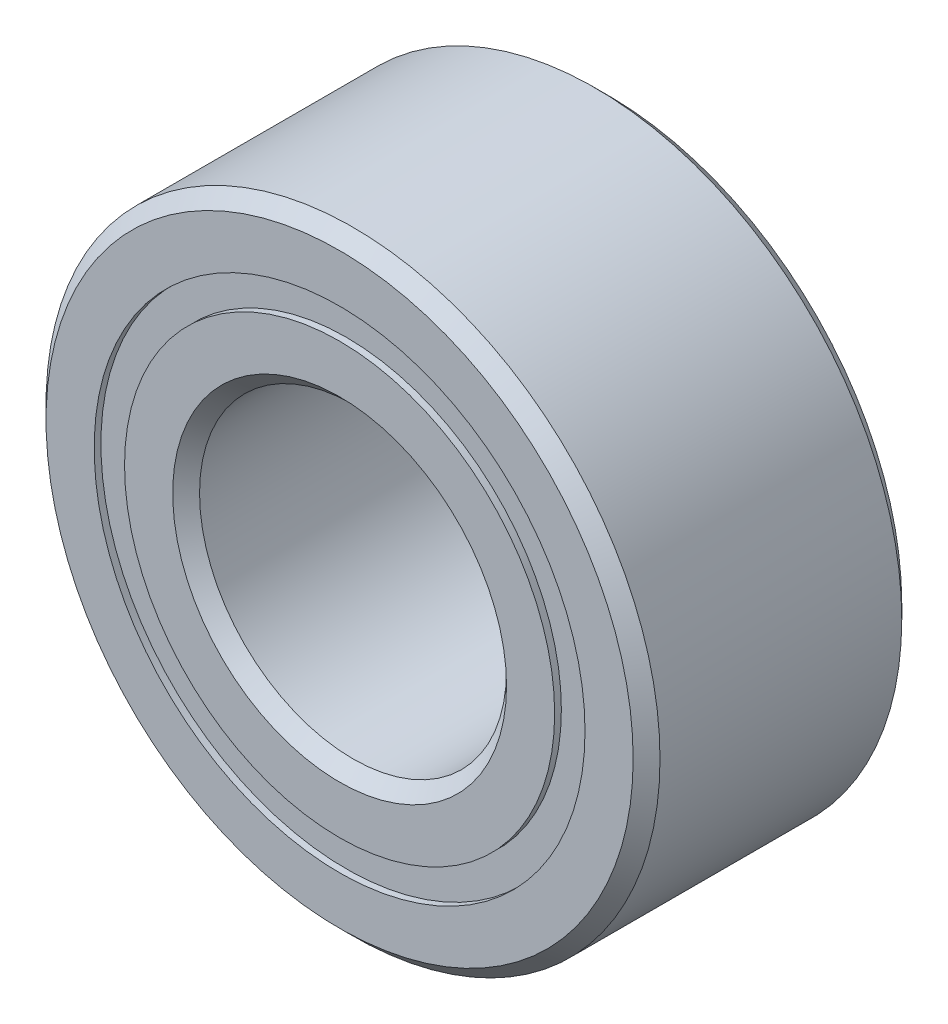
ISO-10303-21;
HEADER;
FILE_DESCRIPTION(('STEP AP214'),'2;1');
FILE_NAME('part.step','',(''),(''),'','','');
FILE_SCHEMA(('AUTOMOTIVE_DESIGN { 1 0 10303 214 1 1 1 1 }'));
ENDSEC;
DATA;
#1=APPLICATION_CONTEXT('core data for automotive mechanical design processes');
#2=APPLICATION_PROTOCOL_DEFINITION('international standard','automotive_design',2000,#1);
#3=PRODUCT_CONTEXT('',#1,'mechanical');
#4=PRODUCT('Part','Part','',(#3));
#5=PRODUCT_RELATED_PRODUCT_CATEGORY('part','',(#4));
#6=PRODUCT_DEFINITION_FORMATION('','',#4);
#7=PRODUCT_DEFINITION_CONTEXT('part definition',#1,'design');
#8=PRODUCT_DEFINITION('design','',#6,#7);
#9=PRODUCT_DEFINITION_SHAPE('','',#8);
#10=(LENGTH_UNIT() NAMED_UNIT(*) SI_UNIT(.MILLI.,.METRE.));
#11=(NAMED_UNIT(*) PLANE_ANGLE_UNIT() SI_UNIT($,.RADIAN.));
#12=(NAMED_UNIT(*) SI_UNIT($,.STERADIAN.) SOLID_ANGLE_UNIT());
#13=UNCERTAINTY_MEASURE_WITH_UNIT(LENGTH_MEASURE(1.E-05),#10,'distance_accuracy_value','');
#14=(GEOMETRIC_REPRESENTATION_CONTEXT(3) GLOBAL_UNCERTAINTY_ASSIGNED_CONTEXT((#13)) GLOBAL_UNIT_ASSIGNED_CONTEXT((#10,
#11,#12)) REPRESENTATION_CONTEXT('',''));
#15=CARTESIAN_POINT('',(0.,0.,0.));
#16=DIRECTION('',(0.,0.,1.));
#17=DIRECTION('',(1.,0.,0.));
#18=AXIS2_PLACEMENT_3D('',#15,#16,#17);
#19=CARTESIAN_POINT('',(0.,2.53825549450549,-1.319609375));
#20=DIRECTION('',(0.,0.,1.));
#21=DIRECTION('',(1.,0.,0.));
#22=AXIS2_PLACEMENT_3D('',#19,#20,#21);
#23=PLANE('',#22);
#24=CARTESIAN_POINT('',(0.,0.,-1.319609375));
#25=DIRECTION('',(0.,0.,1.));
#26=DIRECTION('',(1.,0.,0.));
#27=AXIS2_PLACEMENT_3D('',#24,#25,#26);
#28=CIRCLE('',#27,2.53825549450549);
#29=CARTESIAN_POINT('',(2.53825549450549,0.,-1.319609375));
#30=VERTEX_POINT('',#29);
#31=EDGE_CURVE('E59',#30,#30,#28,.T.);
#32=ORIENTED_EDGE('',*,*,#31,.F.);
#33=EDGE_LOOP('',(#32));
#34=FACE_BOUND('',#33,.T.);
#35=CARTESIAN_POINT('',(0.,0.,-1.319609375));
#36=DIRECTION('',(0.,0.,1.));
#37=DIRECTION('',(1.,0.,0.));
#38=AXIS2_PLACEMENT_3D('',#35,#36,#37);
#39=CIRCLE('',#38,2.22424450549451);
#40=CARTESIAN_POINT('',(2.22424450549451,0.,-1.319609375));
#41=VERTEX_POINT('',#40);
#42=EDGE_CURVE('E11',#41,#41,#39,.T.);
#43=ORIENTED_EDGE('',*,*,#42,.T.);
#44=EDGE_LOOP('',(#43));
#45=FACE_BOUND('',#44,.T.);
#46=ADVANCED_FACE('F45',(#34,#45),#23,.F.);
#47=CARTESIAN_POINT('',(0.,0.,1.3890625));
#48=DIRECTION('',(0.,0.,1.));
#49=DIRECTION('',(1.,0.,0.));
#50=AXIS2_PLACEMENT_3D('',#47,#48,#49);
#51=CYLINDRICAL_SURFACE('',#50,2.22424450549451);
#52=ORIENTED_EDGE('',*,*,#42,.F.);
#53=EDGE_LOOP('',(#52));
#54=FACE_BOUND('',#53,.T.);
#55=CARTESIAN_POINT('',(0.,0.,-0.637012925157144));
#56=DIRECTION('',(0.,0.,1.));
#57=DIRECTION('',(1.,0.,0.));
#58=AXIS2_PLACEMENT_3D('',#55,#56,#57);
#59=CIRCLE('',#58,2.22424450549451);
#60=CARTESIAN_POINT('',(2.22424450549451,0.,-0.637012925157144));
#61=VERTEX_POINT('',#60);
#62=EDGE_CURVE('E51',#61,#61,#59,.T.);
#63=ORIENTED_EDGE('',*,*,#62,.T.);
#64=EDGE_LOOP('',(#63));
#65=FACE_BOUND('',#64,.T.);
#66=ADVANCED_FACE('F68',(#54,#65),#51,.F.);
#67=CARTESIAN_POINT('',(0.,2.53825549450549,-0.637012925157144));
#68=DIRECTION('',(0.,0.,-1.));
#69=DIRECTION('',(-1.,0.,0.));
#70=AXIS2_PLACEMENT_3D('',#67,#68,#69);
#71=PLANE('',#70);
#72=ORIENTED_EDGE('',*,*,#62,.F.);
#73=EDGE_LOOP('',(#72));
#74=FACE_BOUND('',#73,.T.);
#75=CARTESIAN_POINT('',(0.,0.,-0.637012925157144));
#76=DIRECTION('',(0.,0.,1.));
#77=DIRECTION('',(1.,0.,0.));
#78=AXIS2_PLACEMENT_3D('',#75,#76,#77);
#79=CIRCLE('',#78,2.53825549450549);
#80=CARTESIAN_POINT('',(2.53825549450549,0.,-0.637012925157144));
#81=VERTEX_POINT('',#80);
#82=EDGE_CURVE('E55',#81,#81,#79,.T.);
#83=ORIENTED_EDGE('',*,*,#82,.T.);
#84=EDGE_LOOP('',(#83));
#85=FACE_BOUND('',#84,.T.);
#86=ADVANCED_FACE('F72',(#74,#85),#71,.F.);
#87=CARTESIAN_POINT('',(0.,0.,1.3890625));
#88=DIRECTION('',(0.,0.,1.));
#89=DIRECTION('',(1.,0.,0.));
#90=AXIS2_PLACEMENT_3D('',#87,#88,#89);
#91=CYLINDRICAL_SURFACE('',#90,2.53825549450549);
#92=ORIENTED_EDGE('',*,*,#82,.F.);
#93=EDGE_LOOP('',(#92));
#94=FACE_BOUND('',#93,.T.);
#95=ORIENTED_EDGE('',*,*,#31,.T.);
#96=EDGE_LOOP('',(#95));
#97=FACE_BOUND('',#96,.T.);
#98=ADVANCED_FACE('F65',(#94,#97),#91,.T.);
#99=CLOSED_SHELL('',(#46,#66,#86,#98));
#100=MANIFOLD_SOLID_BREP('B2',#99);
#101=CARTESIAN_POINT('',(0.,2.53825549450549,1.319609375));
#102=DIRECTION('',(0.,0.,-1.));
#103=DIRECTION('',(-1.,0.,0.));
#104=AXIS2_PLACEMENT_3D('',#101,#102,#103);
#105=PLANE('',#104);
#106=CARTESIAN_POINT('',(0.,0.,1.319609375));
#107=DIRECTION('',(0.,0.,1.));
#108=DIRECTION('',(1.,0.,0.));
#109=AXIS2_PLACEMENT_3D('',#106,#107,#108);
#110=CIRCLE('',#109,2.2242445054945);
#111=CARTESIAN_POINT('',(2.2242445054945,0.,1.319609375));
#112=VERTEX_POINT('',#111);
#113=EDGE_CURVE('E44',#112,#112,#110,.T.);
#114=ORIENTED_EDGE('',*,*,#113,.F.);
#115=EDGE_LOOP('',(#114));
#116=FACE_BOUND('',#115,.T.);
#117=CARTESIAN_POINT('',(0.,0.,1.319609375));
#118=DIRECTION('',(0.,0.,1.));
#119=DIRECTION('',(1.,0.,0.));
#120=AXIS2_PLACEMENT_3D('',#117,#118,#119);
#121=CIRCLE('',#120,2.53825549450549);
#122=CARTESIAN_POINT('',(2.53825549450549,0.,1.319609375));
#123=VERTEX_POINT('',#122);
#124=EDGE_CURVE('E134',#123,#123,#121,.T.);
#125=ORIENTED_EDGE('',*,*,#124,.T.);
#126=EDGE_LOOP('',(#125));
#127=FACE_BOUND('',#126,.T.);
#128=ADVANCED_FACE('F120',(#116,#127),#105,.F.);
#129=CARTESIAN_POINT('',(0.,0.,1.3890625));
#130=DIRECTION('',(0.,0.,1.));
#131=DIRECTION('',(1.,0.,0.));
#132=AXIS2_PLACEMENT_3D('',#129,#130,#131);
#133=CYLINDRICAL_SURFACE('',#132,2.2242445054945);
#134=CARTESIAN_POINT('',(0.,0.,0.637012925157143));
#135=DIRECTION('',(0.,0.,1.));
#136=DIRECTION('',(1.,0.,0.));
#137=AXIS2_PLACEMENT_3D('',#134,#135,#136);
#138=CIRCLE('',#137,2.2242445054945);
#139=CARTESIAN_POINT('',(2.2242445054945,0.,0.637012925157143));
#140=VERTEX_POINT('',#139);
#141=EDGE_CURVE('E126',#140,#140,#138,.T.);
#142=ORIENTED_EDGE('',*,*,#141,.F.);
#143=EDGE_LOOP('',(#142));
#144=FACE_BOUND('',#143,.T.);
#145=ORIENTED_EDGE('',*,*,#113,.T.);
#146=EDGE_LOOP('',(#145));
#147=FACE_BOUND('',#146,.T.);
#148=ADVANCED_FACE('F149',(#144,#147),#133,.F.);
#149=CARTESIAN_POINT('',(0.,2.53825549450549,0.637012925157143));
#150=DIRECTION('',(0.,0.,1.));
#151=DIRECTION('',(1.,0.,0.));
#152=AXIS2_PLACEMENT_3D('',#149,#150,#151);
#153=PLANE('',#152);
#154=CARTESIAN_POINT('',(0.,0.,0.637012925157143));
#155=DIRECTION('',(0.,0.,1.));
#156=DIRECTION('',(1.,0.,0.));
#157=AXIS2_PLACEMENT_3D('',#154,#155,#156);
#158=CIRCLE('',#157,2.53825549450549);
#159=CARTESIAN_POINT('',(2.53825549450549,0.,0.637012925157143));
#160=VERTEX_POINT('',#159);
#161=EDGE_CURVE('E130',#160,#160,#158,.T.);
#162=ORIENTED_EDGE('',*,*,#161,.F.);
#163=EDGE_LOOP('',(#162));
#164=FACE_BOUND('',#163,.T.);
#165=ORIENTED_EDGE('',*,*,#141,.T.);
#166=EDGE_LOOP('',(#165));
#167=FACE_BOUND('',#166,.T.);
#168=ADVANCED_FACE('F144',(#164,#167),#153,.F.);
#169=CARTESIAN_POINT('',(0.,0.,1.3890625));
#170=DIRECTION('',(0.,0.,1.));
#171=DIRECTION('',(1.,0.,0.));
#172=AXIS2_PLACEMENT_3D('',#169,#170,#171);
#173=CYLINDRICAL_SURFACE('',#172,2.53825549450549);
#174=ORIENTED_EDGE('',*,*,#124,.F.);
#175=EDGE_LOOP('',(#174));
#176=FACE_BOUND('',#175,.T.);
#177=ORIENTED_EDGE('',*,*,#161,.T.);
#178=EDGE_LOOP('',(#177));
#179=FACE_BOUND('',#178,.T.);
#180=ADVANCED_FACE('F141',(#176,#179),#173,.T.);
#181=CLOSED_SHELL('',(#128,#148,#168,#180));
#182=MANIFOLD_SOLID_BREP('B6',#181);
#183=CARTESIAN_POINT('',(-1.39966363202143,1.92647171785536,0.));
#184=DIRECTION('',(0.,0.,1.));
#185=DIRECTION('',(-0.587785252292462,0.809016994374955,0.));
#186=AXIS2_PLACEMENT_3D('',#183,#184,#185);
#187=SPHERICAL_SURFACE('',#186,0.637012925157143);
#188=CARTESIAN_POINT('',(-1.39966363202143,1.92647171785536,0.637012925157143));
#189=VERTEX_POINT('',#188);
#190=VERTEX_LOOP('',#189);
#191=FACE_BOUND('',#190,.T.);
#192=ADVANCED_FACE('F195',(#191),#187,.T.);
#193=CLOSED_SHELL('',(#192));
#194=MANIFOLD_SOLID_BREP('B39',#193);
#195=CARTESIAN_POINT('',(-2.26470332942783,0.735846717855369,0.));
#196=DIRECTION('',(0.,0.,1.));
#197=DIRECTION('',(-0.95105651629515,0.309016994374958,0.));
#198=AXIS2_PLACEMENT_3D('',#195,#196,#197);
#199=SPHERICAL_SURFACE('',#198,0.637012925157143);
#200=CARTESIAN_POINT('',(-2.26470332942783,0.735846717855369,0.637012925157143));
#201=VERTEX_POINT('',#200);
#202=VERTEX_LOOP('',#201);
#203=FACE_BOUND('',#202,.T.);
#204=ADVANCED_FACE('F217',(#203),#199,.T.);
#205=CLOSED_SHELL('',(#204));
#206=MANIFOLD_SOLID_BREP('B116',#205);
#207=CARTESIAN_POINT('',(-2.26470332942784,-0.735846717855322,0.));
#208=DIRECTION('',(0.,0.,1.));
#209=DIRECTION('',(-0.951056516295157,-0.309016994374938,0.));
#210=AXIS2_PLACEMENT_3D('',#207,#208,#209);
#211=SPHERICAL_SURFACE('',#210,0.637012925157143);
#212=CARTESIAN_POINT('',(-2.26470332942784,-0.735846717855322,0.637012925157143));
#213=VERTEX_POINT('',#212);
#214=VERTEX_LOOP('',#213);
#215=FACE_BOUND('',#214,.T.);
#216=ADVANCED_FACE('F239',(#215),#211,.T.);
#217=CLOSED_SHELL('',(#216));
#218=MANIFOLD_SOLID_BREP('B191',#217);
#219=CARTESIAN_POINT('',(-1.39966363202147,-1.92647171785533,0.));
#220=DIRECTION('',(0.,0.,1.));
#221=DIRECTION('',(-0.58778525229248,-0.809016994374942,0.));
#222=AXIS2_PLACEMENT_3D('',#219,#220,#221);
#223=SPHERICAL_SURFACE('',#222,0.637012925157143);
#224=CARTESIAN_POINT('',(-1.39966363202147,-1.92647171785533,0.637012925157143));
#225=VERTEX_POINT('',#224);
#226=VERTEX_LOOP('',#225);
#227=FACE_BOUND('',#226,.T.);
#228=ADVANCED_FACE('F261',(#227),#223,.T.);
#229=CLOSED_SHELL('',(#228));
#230=MANIFOLD_SOLID_BREP('B213',#229);
#231=CARTESIAN_POINT('',(0.,-2.38125,0.));
#232=DIRECTION('',(0.,0.,1.));
#233=DIRECTION('',(0.,-1.,0.));
#234=AXIS2_PLACEMENT_3D('',#231,#232,#233);
#235=SPHERICAL_SURFACE('',#234,0.637012925157143);
#236=CARTESIAN_POINT('',(0.,-2.38125,0.637012925157143));
#237=VERTEX_POINT('',#236);
#238=VERTEX_LOOP('',#237);
#239=FACE_BOUND('',#238,.T.);
#240=ADVANCED_FACE('F283',(#239),#235,.T.);
#241=CLOSED_SHELL('',(#240));
#242=MANIFOLD_SOLID_BREP('B235',#241);
#243=CARTESIAN_POINT('',(1.39966363202144,-1.92647171785535,0.));
#244=DIRECTION('',(0.,0.,1.));
#245=DIRECTION('',(0.587785252292469,-0.809016994374951,0.));
#246=AXIS2_PLACEMENT_3D('',#243,#244,#245);
#247=SPHERICAL_SURFACE('',#246,0.637012925157143);
#248=CARTESIAN_POINT('',(1.39966363202144,-1.92647171785535,0.637012925157143));
#249=VERTEX_POINT('',#248);
#250=VERTEX_LOOP('',#249);
#251=FACE_BOUND('',#250,.T.);
#252=ADVANCED_FACE('F305',(#251),#247,.T.);
#253=CLOSED_SHELL('',(#252));
#254=MANIFOLD_SOLID_BREP('B257',#253);
#255=CARTESIAN_POINT('',(2.26470332942783,-0.735846717855353,0.));
#256=DIRECTION('',(0.,0.,1.));
#257=DIRECTION('',(0.951056516295152,-0.309016994374952,0.));
#258=AXIS2_PLACEMENT_3D('',#255,#256,#257);
#259=SPHERICAL_SURFACE('',#258,0.637012925157143);
#260=CARTESIAN_POINT('',(2.26470332942783,-0.735846717855353,0.637012925157143));
#261=VERTEX_POINT('',#260);
#262=VERTEX_LOOP('',#261);
#263=FACE_BOUND('',#262,.T.);
#264=ADVANCED_FACE('F327',(#263),#259,.T.);
#265=CLOSED_SHELL('',(#264));
#266=MANIFOLD_SOLID_BREP('B279',#265);
#267=CARTESIAN_POINT('',(2.26470332942784,0.735846717855337,0.));
#268=DIRECTION('',(0.,0.,1.));
#269=DIRECTION('',(0.951056516295155,0.309016994374945,0.));
#270=AXIS2_PLACEMENT_3D('',#267,#268,#269);
#271=SPHERICAL_SURFACE('',#270,0.637012925157143);
#272=CARTESIAN_POINT('',(2.26470332942784,0.735846717855337,0.637012925157143));
#273=VERTEX_POINT('',#272);
#274=VERTEX_LOOP('',#273);
#275=FACE_BOUND('',#274,.T.);
#276=ADVANCED_FACE('F349',(#275),#271,.T.);
#277=CLOSED_SHELL('',(#276));
#278=MANIFOLD_SOLID_BREP('B301',#277);
#279=CARTESIAN_POINT('',(1.39966363202145,1.92647171785534,0.));
#280=DIRECTION('',(0.,0.,1.));
#281=DIRECTION('',(0.587785252292474,0.809016994374947,0.));
#282=AXIS2_PLACEMENT_3D('',#279,#280,#281);
#283=SPHERICAL_SURFACE('',#282,0.637012925157143);
#284=CARTESIAN_POINT('',(1.39966363202145,1.92647171785534,0.637012925157143));
#285=VERTEX_POINT('',#284);
#286=VERTEX_LOOP('',#285);
#287=FACE_BOUND('',#286,.T.);
#288=ADVANCED_FACE('F371',(#287),#283,.T.);
#289=CLOSED_SHELL('',(#288));
#290=MANIFOLD_SOLID_BREP('B323',#289);
#291=CARTESIAN_POINT('',(0.,2.38125,0.));
#292=DIRECTION('',(0.,0.,1.));
#293=DIRECTION('',(0.,1.,0.));
#294=AXIS2_PLACEMENT_3D('',#291,#292,#293);
#295=SPHERICAL_SURFACE('',#294,0.637012925157143);
#296=CARTESIAN_POINT('',(0.,2.38125,0.637012925157143));
#297=VERTEX_POINT('',#296);
#298=VERTEX_LOOP('',#297);
#299=FACE_BOUND('',#298,.T.);
#300=ADVANCED_FACE('F395',(#299),#295,.T.);
#301=CLOSED_SHELL('',(#300));
#302=MANIFOLD_SOLID_BREP('B345',#301);
#303=CARTESIAN_POINT('',(0.,2.22424450549451,1.3890625));
#304=DIRECTION('',(0.,0.,-1.));
#305=DIRECTION('',(-1.,0.,0.));
#306=AXIS2_PLACEMENT_3D('',#303,#304,#305);
#307=PLANE('',#306);
#308=CARTESIAN_POINT('',(0.,0.,1.3890625));
#309=DIRECTION('',(0.,0.,1.));
#310=DIRECTION('',(1.,0.,0.));
#311=AXIS2_PLACEMENT_3D('',#308,#309,#310);
#312=CIRCLE('',#311,1.72640625);
#313=CARTESIAN_POINT('',(1.72640625,0.,1.3890625));
#314=VERTEX_POINT('',#313);
#315=EDGE_CURVE('E444',#314,#314,#312,.T.);
#316=ORIENTED_EDGE('',*,*,#315,.F.);
#317=EDGE_LOOP('',(#316));
#318=FACE_BOUND('',#317,.T.);
#319=CARTESIAN_POINT('',(0.,0.,1.3890625));
#320=DIRECTION('',(0.,0.,1.));
#321=DIRECTION('',(1.,0.,0.));
#322=AXIS2_PLACEMENT_3D('',#319,#320,#321);
#323=CIRCLE('',#322,2.22424450549451);
#324=CARTESIAN_POINT('',(2.22424450549451,0.,1.3890625));
#325=VERTEX_POINT('',#324);
#326=EDGE_CURVE('E394',#325,#325,#323,.T.);
#327=ORIENTED_EDGE('',*,*,#326,.T.);
#328=EDGE_LOOP('',(#327));
#329=FACE_BOUND('',#328,.T.);
#330=ADVANCED_FACE('F416',(#318,#329),#307,.F.);
#331=CARTESIAN_POINT('',(0.,0.,1.3890625));
#332=DIRECTION('',(0.,0.,1.));
#333=DIRECTION('',(1.,0.,0.));
#334=AXIS2_PLACEMENT_3D('',#331,#332,#333);
#335=CYLINDRICAL_SURFACE('',#334,2.22424450549451);
#336=ORIENTED_EDGE('',*,*,#326,.F.);
#337=EDGE_LOOP('',(#336));
#338=FACE_BOUND('',#337,.T.);
#339=CARTESIAN_POINT('',(0.,0.,0.617361111111111));
#340=DIRECTION('',(0.,0.,1.));
#341=DIRECTION('',(1.,0.,0.));
#342=AXIS2_PLACEMENT_3D('',#339,#340,#341);
#343=CIRCLE('',#342,2.2242445054945);
#344=CARTESIAN_POINT('',(2.2242445054945,0.,0.617361111111111));
#345=VERTEX_POINT('',#344);
#346=EDGE_CURVE('E422',#345,#345,#343,.T.);
#347=ORIENTED_EDGE('',*,*,#346,.T.);
#348=EDGE_LOOP('',(#347));
#349=FACE_BOUND('',#348,.T.);
#350=ADVANCED_FACE('F451',(#338,#349),#335,.T.);
#351=CARTESIAN_POINT('',(0.,0.,0.));
#352=DIRECTION('',(0.,0.,1.));
#353=DIRECTION('',(1.,0.,0.));
#354=AXIS2_PLACEMENT_3D('',#351,#352,#353);
#355=TOROIDAL_SURFACE('',#354,2.38124999999999,0.637012925157142);
#356=ORIENTED_EDGE('',*,*,#346,.F.);
#357=EDGE_LOOP('',(#356));
#358=FACE_BOUND('',#357,.T.);
#359=CARTESIAN_POINT('',(0.,0.,-0.617361111111113));
#360=DIRECTION('',(0.,0.,1.));
#361=DIRECTION('',(1.,0.,0.));
#362=AXIS2_PLACEMENT_3D('',#359,#360,#361);
#363=CIRCLE('',#362,2.2242445054945);
#364=CARTESIAN_POINT('',(2.2242445054945,0.,-0.617361111111113));
#365=VERTEX_POINT('',#364);
#366=EDGE_CURVE('E426',#365,#365,#363,.T.);
#367=ORIENTED_EDGE('',*,*,#366,.T.);
#368=EDGE_LOOP('',(#367));
#369=FACE_BOUND('',#368,.T.);
#370=ADVANCED_FACE('F455',(#358,#369),#355,.F.);
#371=CARTESIAN_POINT('',(0.,0.,1.3890625));
#372=DIRECTION('',(0.,0.,1.));
#373=DIRECTION('',(1.,0.,0.));
#374=AXIS2_PLACEMENT_3D('',#371,#372,#373);
#375=CYLINDRICAL_SURFACE('',#374,2.22424450549451);
#376=ORIENTED_EDGE('',*,*,#366,.F.);
#377=EDGE_LOOP('',(#376));
#378=FACE_BOUND('',#377,.T.);
#379=CARTESIAN_POINT('',(0.,0.,-1.3890625));
#380=DIRECTION('',(0.,0.,1.));
#381=DIRECTION('',(1.,0.,0.));
#382=AXIS2_PLACEMENT_3D('',#379,#380,#381);
#383=CIRCLE('',#382,2.22424450549451);
#384=CARTESIAN_POINT('',(2.22424450549451,0.,-1.3890625));
#385=VERTEX_POINT('',#384);
#386=EDGE_CURVE('E430',#385,#385,#383,.T.);
#387=ORIENTED_EDGE('',*,*,#386,.T.);
#388=EDGE_LOOP('',(#387));
#389=FACE_BOUND('',#388,.T.);
#390=ADVANCED_FACE('F460',(#378,#389),#375,.T.);
#391=CARTESIAN_POINT('',(0.,1.72640625,-1.3890625));
#392=DIRECTION('',(0.,0.,1.));
#393=DIRECTION('',(1.,0.,0.));
#394=AXIS2_PLACEMENT_3D('',#391,#392,#393);
#395=PLANE('',#394);
#396=ORIENTED_EDGE('',*,*,#386,.F.);
#397=EDGE_LOOP('',(#396));
#398=FACE_BOUND('',#397,.T.);
#399=CARTESIAN_POINT('',(0.,0.,-1.3890625));
#400=DIRECTION('',(0.,0.,1.));
#401=DIRECTION('',(1.,0.,0.));
#402=AXIS2_PLACEMENT_3D('',#399,#400,#401);
#403=CIRCLE('',#402,1.72640625);
#404=CARTESIAN_POINT('',(1.72640625,0.,-1.3890625));
#405=VERTEX_POINT('',#404);
#406=EDGE_CURVE('E435',#405,#405,#403,.T.);
#407=ORIENTED_EDGE('',*,*,#406,.T.);
#408=EDGE_LOOP('',(#407));
#409=FACE_BOUND('',#408,.T.);
#410=ADVANCED_FACE('F466',(#398,#409),#395,.F.);
#411=CARTESIAN_POINT('',(0.,0.,-1.25015625));
#412=DIRECTION('',(0.,0.,-1.));
#413=DIRECTION('',(-1.,0.,0.));
#414=AXIS2_PLACEMENT_3D('',#411,#412,#413);
#415=CONICAL_SURFACE('',#414,1.5875,0.785398163397452);
#416=ORIENTED_EDGE('',*,*,#406,.F.);
#417=EDGE_LOOP('',(#416));
#418=FACE_BOUND('',#417,.T.);
#419=CARTESIAN_POINT('',(0.,0.,-1.25015625));
#420=DIRECTION('',(0.,0.,1.));
#421=DIRECTION('',(1.,0.,0.));
#422=AXIS2_PLACEMENT_3D('',#419,#420,#421);
#423=CIRCLE('',#422,1.5875);
#424=CARTESIAN_POINT('',(1.5875,0.,-1.25015625));
#425=VERTEX_POINT('',#424);
#426=EDGE_CURVE('E438',#425,#425,#423,.T.);
#427=ORIENTED_EDGE('',*,*,#426,.T.);
#428=EDGE_LOOP('',(#427));
#429=FACE_BOUND('',#428,.T.);
#430=ADVANCED_FACE('F470',(#418,#429),#415,.F.);
#431=CARTESIAN_POINT('',(0.,0.,1.3890625));
#432=DIRECTION('',(0.,0.,1.));
#433=DIRECTION('',(1.,0.,0.));
#434=AXIS2_PLACEMENT_3D('',#431,#432,#433);
#435=CYLINDRICAL_SURFACE('',#434,1.5875);
#436=ORIENTED_EDGE('',*,*,#426,.F.);
#437=EDGE_LOOP('',(#436));
#438=FACE_BOUND('',#437,.T.);
#439=CARTESIAN_POINT('',(0.,0.,1.25015625));
#440=DIRECTION('',(0.,0.,1.));
#441=DIRECTION('',(1.,0.,0.));
#442=AXIS2_PLACEMENT_3D('',#439,#440,#441);
#443=CIRCLE('',#442,1.5875);
#444=CARTESIAN_POINT('',(1.5875,0.,1.25015625));
#445=VERTEX_POINT('',#444);
#446=EDGE_CURVE('E441',#445,#445,#443,.T.);
#447=ORIENTED_EDGE('',*,*,#446,.T.);
#448=EDGE_LOOP('',(#447));
#449=FACE_BOUND('',#448,.T.);
#450=ADVANCED_FACE('F474',(#438,#449),#435,.F.);
#451=CARTESIAN_POINT('',(0.,0.,1.3890625));
#452=DIRECTION('',(0.,0.,1.));
#453=DIRECTION('',(1.,0.,0.));
#454=AXIS2_PLACEMENT_3D('',#451,#452,#453);
#455=CONICAL_SURFACE('',#454,1.72640625,0.785398163397442);
#456=ORIENTED_EDGE('',*,*,#446,.F.);
#457=EDGE_LOOP('',(#456));
#458=FACE_BOUND('',#457,.T.);
#459=ORIENTED_EDGE('',*,*,#315,.T.);
#460=EDGE_LOOP('',(#459));
#461=FACE_BOUND('',#460,.T.);
#462=ADVANCED_FACE('F448',(#458,#461),#455,.F.);
#463=CLOSED_SHELL('',(#330,#350,#370,#390,#410,#430,#450,#462));
#464=MANIFOLD_SOLID_BREP('B367',#463);
#465=CARTESIAN_POINT('',(0.,0.,1.25015625));
#466=DIRECTION('',(0.,0.,-1.));
#467=DIRECTION('',(-1.,0.,0.));
#468=AXIS2_PLACEMENT_3D('',#465,#466,#467);
#469=CONICAL_SURFACE('',#468,3.175,0.785398163397446);
#470=CARTESIAN_POINT('',(0.,0.,1.3890625));
#471=DIRECTION('',(0.,0.,1.));
#472=DIRECTION('',(1.,0.,0.));
#473=AXIS2_PLACEMENT_3D('',#470,#471,#472);
#474=CIRCLE('',#473,3.03609375);
#475=CARTESIAN_POINT('',(3.03609375,0.,1.3890625));
#476=VERTEX_POINT('',#475);
#477=EDGE_CURVE('E581',#476,#476,#474,.T.);
#478=ORIENTED_EDGE('',*,*,#477,.F.);
#479=EDGE_LOOP('',(#478));
#480=FACE_BOUND('',#479,.T.);
#481=CARTESIAN_POINT('',(0.,0.,1.25015625));
#482=DIRECTION('',(0.,0.,1.));
#483=DIRECTION('',(1.,0.,0.));
#484=AXIS2_PLACEMENT_3D('',#481,#482,#483);
#485=CIRCLE('',#484,3.175);
#486=CARTESIAN_POINT('',(3.175,0.,1.25015625));
#487=VERTEX_POINT('',#486);
#488=EDGE_CURVE('E415',#487,#487,#485,.T.);
#489=ORIENTED_EDGE('',*,*,#488,.T.);
#490=EDGE_LOOP('',(#489));
#491=FACE_BOUND('',#490,.T.);
#492=ADVANCED_FACE('F553',(#480,#491),#469,.T.);
#493=CARTESIAN_POINT('',(0.,0.,1.3890625));
#494=DIRECTION('',(0.,0.,1.));
#495=DIRECTION('',(1.,0.,0.));
#496=AXIS2_PLACEMENT_3D('',#493,#494,#495);
#497=CYLINDRICAL_SURFACE('',#496,3.175);
#498=ORIENTED_EDGE('',*,*,#488,.F.);
#499=EDGE_LOOP('',(#498));
#500=FACE_BOUND('',#499,.T.);
#501=CARTESIAN_POINT('',(0.,0.,-1.25015625));
#502=DIRECTION('',(0.,0.,1.));
#503=DIRECTION('',(1.,0.,0.));
#504=AXIS2_PLACEMENT_3D('',#501,#502,#503);
#505=CIRCLE('',#504,3.175);
#506=CARTESIAN_POINT('',(3.175,0.,-1.25015625));
#507=VERTEX_POINT('',#506);
#508=EDGE_CURVE('E559',#507,#507,#505,.T.);
#509=ORIENTED_EDGE('',*,*,#508,.T.);
#510=EDGE_LOOP('',(#509));
#511=FACE_BOUND('',#510,.T.);
#512=ADVANCED_FACE('F588',(#500,#511),#497,.T.);
#513=CARTESIAN_POINT('',(0.,0.,-1.3890625));
#514=DIRECTION('',(0.,0.,1.));
#515=DIRECTION('',(1.,0.,0.));
#516=AXIS2_PLACEMENT_3D('',#513,#514,#515);
#517=CONICAL_SURFACE('',#516,3.03609375,0.785398163397445);
#518=ORIENTED_EDGE('',*,*,#508,.F.);
#519=EDGE_LOOP('',(#518));
#520=FACE_BOUND('',#519,.T.);
#521=CARTESIAN_POINT('',(0.,0.,-1.3890625));
#522=DIRECTION('',(0.,0.,1.));
#523=DIRECTION('',(1.,0.,0.));
#524=AXIS2_PLACEMENT_3D('',#521,#522,#523);
#525=CIRCLE('',#524,3.03609375);
#526=CARTESIAN_POINT('',(3.03609375,0.,-1.3890625));
#527=VERTEX_POINT('',#526);
#528=EDGE_CURVE('E563',#527,#527,#525,.T.);
#529=ORIENTED_EDGE('',*,*,#528,.T.);
#530=EDGE_LOOP('',(#529));
#531=FACE_BOUND('',#530,.T.);
#532=ADVANCED_FACE('F592',(#520,#531),#517,.T.);
#533=CARTESIAN_POINT('',(0.,3.03609375,-1.3890625));
#534=DIRECTION('',(0.,0.,1.));
#535=DIRECTION('',(1.,0.,0.));
#536=AXIS2_PLACEMENT_3D('',#533,#534,#535);
#537=PLANE('',#536);
#538=ORIENTED_EDGE('',*,*,#528,.F.);
#539=EDGE_LOOP('',(#538));
#540=FACE_BOUND('',#539,.T.);
#541=CARTESIAN_POINT('',(0.,0.,-1.3890625));
#542=DIRECTION('',(0.,0.,1.));
#543=DIRECTION('',(1.,0.,0.));
#544=AXIS2_PLACEMENT_3D('',#541,#542,#543);
#545=CIRCLE('',#544,2.53825549450549);
#546=CARTESIAN_POINT('',(2.53825549450549,0.,-1.3890625));
#547=VERTEX_POINT('',#546);
#548=EDGE_CURVE('E567',#547,#547,#545,.T.);
#549=ORIENTED_EDGE('',*,*,#548,.T.);
#550=EDGE_LOOP('',(#549));
#551=FACE_BOUND('',#550,.T.);
#552=ADVANCED_FACE('F597',(#540,#551),#537,.F.);
#553=CARTESIAN_POINT('',(0.,0.,1.3890625));
#554=DIRECTION('',(0.,0.,1.));
#555=DIRECTION('',(1.,0.,0.));
#556=AXIS2_PLACEMENT_3D('',#553,#554,#555);
#557=CYLINDRICAL_SURFACE('',#556,2.53825549450549);
#558=ORIENTED_EDGE('',*,*,#548,.F.);
#559=EDGE_LOOP('',(#558));
#560=FACE_BOUND('',#559,.T.);
#561=CARTESIAN_POINT('',(0.,0.,-0.617361111111112));
#562=DIRECTION('',(0.,0.,1.));
#563=DIRECTION('',(1.,0.,0.));
#564=AXIS2_PLACEMENT_3D('',#561,#562,#563);
#565=CIRCLE('',#564,2.53825549450549);
#566=CARTESIAN_POINT('',(2.53825549450549,0.,-0.617361111111112));
#567=VERTEX_POINT('',#566);
#568=EDGE_CURVE('E572',#567,#567,#565,.T.);
#569=ORIENTED_EDGE('',*,*,#568,.T.);
#570=EDGE_LOOP('',(#569));
#571=FACE_BOUND('',#570,.T.);
#572=ADVANCED_FACE('F603',(#560,#571),#557,.F.);
#573=CARTESIAN_POINT('',(0.,0.,0.));
#574=DIRECTION('',(0.,0.,1.));
#575=DIRECTION('',(1.,0.,0.));
#576=AXIS2_PLACEMENT_3D('',#573,#574,#575);
#577=TOROIDAL_SURFACE('',#576,2.38125,0.637012925157143);
#578=ORIENTED_EDGE('',*,*,#568,.F.);
#579=EDGE_LOOP('',(#578));
#580=FACE_BOUND('',#579,.T.);
#581=CARTESIAN_POINT('',(0.,0.,0.617361111111111));
#582=DIRECTION('',(0.,0.,1.));
#583=DIRECTION('',(1.,0.,0.));
#584=AXIS2_PLACEMENT_3D('',#581,#582,#583);
#585=CIRCLE('',#584,2.53825549450549);
#586=CARTESIAN_POINT('',(2.53825549450549,0.,0.617361111111111));
#587=VERTEX_POINT('',#586);
#588=EDGE_CURVE('E575',#587,#587,#585,.T.);
#589=ORIENTED_EDGE('',*,*,#588,.T.);
#590=EDGE_LOOP('',(#589));
#591=FACE_BOUND('',#590,.T.);
#592=ADVANCED_FACE('F607',(#580,#591),#577,.F.);
#593=CARTESIAN_POINT('',(0.,0.,1.3890625));
#594=DIRECTION('',(0.,0.,1.));
#595=DIRECTION('',(1.,0.,0.));
#596=AXIS2_PLACEMENT_3D('',#593,#594,#595);
#597=CYLINDRICAL_SURFACE('',#596,2.53825549450549);
#598=ORIENTED_EDGE('',*,*,#588,.F.);
#599=EDGE_LOOP('',(#598));
#600=FACE_BOUND('',#599,.T.);
#601=CARTESIAN_POINT('',(0.,0.,1.3890625));
#602=DIRECTION('',(0.,0.,1.));
#603=DIRECTION('',(1.,0.,0.));
#604=AXIS2_PLACEMENT_3D('',#601,#602,#603);
#605=CIRCLE('',#604,2.53825549450549);
#606=CARTESIAN_POINT('',(2.53825549450549,0.,1.3890625));
#607=VERTEX_POINT('',#606);
#608=EDGE_CURVE('E578',#607,#607,#605,.T.);
#609=ORIENTED_EDGE('',*,*,#608,.T.);
#610=EDGE_LOOP('',(#609));
#611=FACE_BOUND('',#610,.T.);
#612=ADVANCED_FACE('F611',(#600,#611),#597,.F.);
#613=CARTESIAN_POINT('',(0.,3.03609375,1.3890625));
#614=DIRECTION('',(0.,0.,-1.));
#615=DIRECTION('',(-1.,0.,0.));
#616=AXIS2_PLACEMENT_3D('',#613,#614,#615);
#617=PLANE('',#616);
#618=ORIENTED_EDGE('',*,*,#608,.F.);
#619=EDGE_LOOP('',(#618));
#620=FACE_BOUND('',#619,.T.);
#621=ORIENTED_EDGE('',*,*,#477,.T.);
#622=EDGE_LOOP('',(#621));
#623=FACE_BOUND('',#622,.T.);
#624=ADVANCED_FACE('F585',(#620,#623),#617,.F.);
#625=CLOSED_SHELL('',(#492,#512,#532,#552,#572,#592,#612,#624));
#626=MANIFOLD_SOLID_BREP('B389',#625);
#627=ADVANCED_BREP_SHAPE_REPRESENTATION('',(#18,#100,#182,#194,#206,#218,#230,#242,#254,#266,
#278,#290,#302,#464,#626),#14);
#628=SHAPE_DEFINITION_REPRESENTATION(#9,#627);
ENDSEC;
END-ISO-10303-21;
